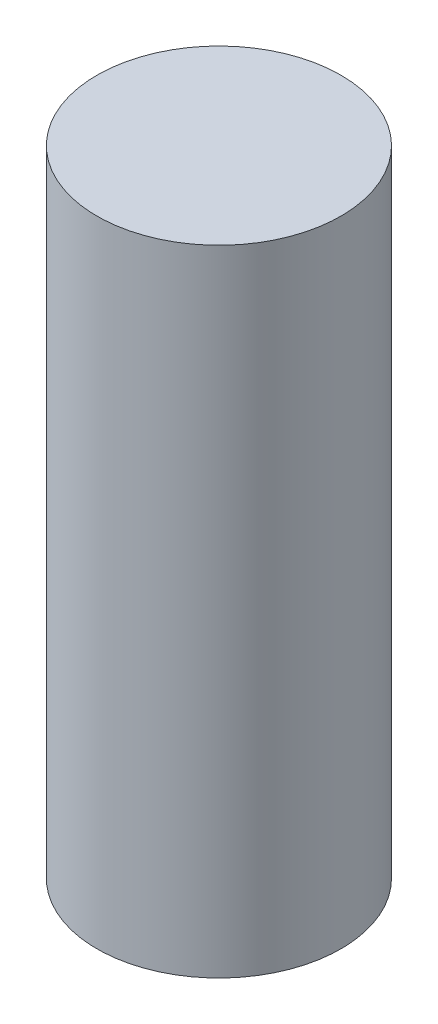
ISO-10303-21;
HEADER;
FILE_DESCRIPTION(('STEP AP214'),'2;1');
FILE_NAME('part.step','',(''),(''),'','','');
FILE_SCHEMA(('AUTOMOTIVE_DESIGN { 1 0 10303 214 1 1 1 1 }'));
ENDSEC;
DATA;
#1=APPLICATION_CONTEXT('core data for automotive mechanical design processes');
#2=APPLICATION_PROTOCOL_DEFINITION('international standard','automotive_design',2000,#1);
#3=PRODUCT_CONTEXT('',#1,'mechanical');
#4=PRODUCT('Part','Part','',(#3));
#5=PRODUCT_RELATED_PRODUCT_CATEGORY('part','',(#4));
#6=PRODUCT_DEFINITION_FORMATION('','',#4);
#7=PRODUCT_DEFINITION_CONTEXT('part definition',#1,'design');
#8=PRODUCT_DEFINITION('design','',#6,#7);
#9=PRODUCT_DEFINITION_SHAPE('','',#8);
#10=(LENGTH_UNIT() NAMED_UNIT(*) SI_UNIT(.MILLI.,.METRE.));
#11=(NAMED_UNIT(*) PLANE_ANGLE_UNIT() SI_UNIT($,.RADIAN.));
#12=(NAMED_UNIT(*) SI_UNIT($,.STERADIAN.) SOLID_ANGLE_UNIT());
#13=UNCERTAINTY_MEASURE_WITH_UNIT(LENGTH_MEASURE(1.E-05),#10,'distance_accuracy_value','');
#14=(GEOMETRIC_REPRESENTATION_CONTEXT(3) GLOBAL_UNCERTAINTY_ASSIGNED_CONTEXT((#13)) GLOBAL_UNIT_ASSIGNED_CONTEXT((#10,
#11,#12)) REPRESENTATION_CONTEXT('',''));
#15=CARTESIAN_POINT('',(0.,0.,0.));
#16=DIRECTION('',(0.,0.,1.));
#17=DIRECTION('',(1.,0.,0.));
#18=AXIS2_PLACEMENT_3D('',#15,#16,#17);
#19=CARTESIAN_POINT('',(0.,13.,0.));
#20=DIRECTION('',(0.,-1.,0.));
#21=DIRECTION('',(0.,0.,-1.));
#22=AXIS2_PLACEMENT_3D('',#19,#20,#21);
#23=CYLINDRICAL_SURFACE('',#22,2.5);
#24=CARTESIAN_POINT('',(0.,13.,0.));
#25=DIRECTION('',(0.,1.,0.));
#26=DIRECTION('',(0.,0.,1.));
#27=AXIS2_PLACEMENT_3D('',#24,#25,#26);
#28=CIRCLE('',#27,2.5);
#29=CARTESIAN_POINT('',(0.,13.,-2.5));
#30=VERTEX_POINT('',#29);
#31=EDGE_CURVE('E10',#30,#30,#28,.T.);
#32=CARTESIAN_POINT('',(0.,0.,0.));
#33=DIRECTION('',(0.,1.,0.));
#34=DIRECTION('',(0.,0.,1.));
#35=AXIS2_PLACEMENT_3D('',#32,#33,#34);
#36=CIRCLE('',#35,2.5);
#37=CARTESIAN_POINT('',(0.,0.,-2.5));
#38=VERTEX_POINT('',#37);
#39=EDGE_CURVE('E34',#38,#38,#36,.T.);
#40=CARTESIAN_POINT('',(0.,13.,-2.5));
#41=CARTESIAN_POINT('',(0.,12.8645833333333,-2.5));
#42=CARTESIAN_POINT('',(0.,12.7291666666667,-2.5));
#43=CARTESIAN_POINT('',(0.,12.4583333333333,-2.5));
#44=CARTESIAN_POINT('',(0.,12.3229166666667,-2.5));
#45=CARTESIAN_POINT('',(0.,12.0520833333333,-2.5));
#46=CARTESIAN_POINT('',(0.,11.9166666666667,-2.5));
#47=CARTESIAN_POINT('',(0.,11.6458333333333,-2.5));
#48=CARTESIAN_POINT('',(0.,11.5104166666667,-2.5));
#49=CARTESIAN_POINT('',(0.,11.2395833333333,-2.5));
#50=CARTESIAN_POINT('',(0.,11.1041666666667,-2.5));
#51=CARTESIAN_POINT('',(0.,10.8333333333333,-2.5));
#52=CARTESIAN_POINT('',(0.,10.6979166666667,-2.5));
#53=CARTESIAN_POINT('',(0.,10.4270833333333,-2.5));
#54=CARTESIAN_POINT('',(0.,10.2916666666667,-2.5));
#55=CARTESIAN_POINT('',(0.,10.0208333333333,-2.5));
#56=CARTESIAN_POINT('',(0.,9.88541666666667,-2.5));
#57=CARTESIAN_POINT('',(0.,9.61458333333333,-2.5));
#58=CARTESIAN_POINT('',(0.,9.47916666666667,-2.5));
#59=CARTESIAN_POINT('',(0.,9.20833333333333,-2.5));
#60=CARTESIAN_POINT('',(0.,9.07291666666667,-2.5));
#61=CARTESIAN_POINT('',(0.,8.80208333333333,-2.5));
#62=CARTESIAN_POINT('',(0.,8.66666666666667,-2.5));
#63=CARTESIAN_POINT('',(0.,8.39583333333333,-2.5));
#64=CARTESIAN_POINT('',(0.,8.26041666666667,-2.5));
#65=CARTESIAN_POINT('',(0.,7.98958333333333,-2.5));
#66=CARTESIAN_POINT('',(0.,7.85416666666667,-2.5));
#67=CARTESIAN_POINT('',(0.,7.58333333333333,-2.5));
#68=CARTESIAN_POINT('',(0.,7.44791666666667,-2.5));
#69=CARTESIAN_POINT('',(0.,7.17708333333333,-2.5));
#70=CARTESIAN_POINT('',(0.,7.04166666666667,-2.5));
#71=CARTESIAN_POINT('',(0.,6.77083333333333,-2.5));
#72=CARTESIAN_POINT('',(0.,6.63541666666667,-2.5));
#73=CARTESIAN_POINT('',(0.,6.36458333333333,-2.5));
#74=CARTESIAN_POINT('',(0.,6.22916666666667,-2.5));
#75=CARTESIAN_POINT('',(0.,5.95833333333333,-2.5));
#76=CARTESIAN_POINT('',(0.,5.82291666666667,-2.5));
#77=CARTESIAN_POINT('',(0.,5.55208333333333,-2.5));
#78=CARTESIAN_POINT('',(0.,5.41666666666667,-2.5));
#79=CARTESIAN_POINT('',(0.,5.14583333333333,-2.5));
#80=CARTESIAN_POINT('',(0.,5.01041666666667,-2.5));
#81=CARTESIAN_POINT('',(0.,4.73958333333333,-2.5));
#82=CARTESIAN_POINT('',(0.,4.60416666666667,-2.5));
#83=CARTESIAN_POINT('',(0.,4.33333333333333,-2.5));
#84=CARTESIAN_POINT('',(0.,4.19791666666667,-2.5));
#85=CARTESIAN_POINT('',(0.,3.92708333333333,-2.5));
#86=CARTESIAN_POINT('',(0.,3.79166666666667,-2.5));
#87=CARTESIAN_POINT('',(0.,3.52083333333333,-2.5));
#88=CARTESIAN_POINT('',(0.,3.38541666666667,-2.5));
#89=CARTESIAN_POINT('',(0.,3.11458333333333,-2.5));
#90=CARTESIAN_POINT('',(0.,2.97916666666667,-2.5));
#91=CARTESIAN_POINT('',(0.,2.70833333333333,-2.5));
#92=CARTESIAN_POINT('',(0.,2.57291666666667,-2.5));
#93=CARTESIAN_POINT('',(0.,2.30208333333333,-2.5));
#94=CARTESIAN_POINT('',(0.,2.16666666666667,-2.5));
#95=CARTESIAN_POINT('',(0.,1.89583333333333,-2.5));
#96=CARTESIAN_POINT('',(0.,1.76041666666667,-2.5));
#97=CARTESIAN_POINT('',(0.,1.48958333333333,-2.5));
#98=CARTESIAN_POINT('',(0.,1.35416666666667,-2.5));
#99=CARTESIAN_POINT('',(0.,1.08333333333333,-2.5));
#100=CARTESIAN_POINT('',(0.,0.947916666666667,-2.5));
#101=CARTESIAN_POINT('',(0.,0.677083333333334,-2.5));
#102=CARTESIAN_POINT('',(0.,0.541666666666667,-2.5));
#103=CARTESIAN_POINT('',(0.,0.270833333333334,-2.5));
#104=CARTESIAN_POINT('',(0.,0.135416666666667,-2.5));
#105=CARTESIAN_POINT('',(0.,0.,-2.5));
#106=B_SPLINE_CURVE_WITH_KNOTS('',3,(#40,#41,#42,#43,#44,#45,#46,#47,#48,#49,#50,#51,#52,#53,
#54,#55,#56,#57,#58,#59,#60,#61,#62,#63,#64,#65,#66,#67,#68,#69,#70,#71,#72,#73,#74,#75,#76,#77,
#78,#79,#80,#81,#82,#83,#84,#85,#86,#87,#88,#89,#90,#91,#92,#93,#94,#95,#96,#97,#98,#99,#100,
#101,#102,#103,#104,#105),.UNSPECIFIED.,.F.,.F.,(4,2,2,2,2,2,2,2,2,2,2,2,2,2,2,2,2,2,2,2,2,2,2,
2,2,2,2,2,2,2,2,2,4),(0.,0.406249999999999,0.812499999999999,1.21875,1.625,2.03125,2.4375,
2.84375,3.25,3.65625,4.0625,4.46875,4.875,5.28125,5.6875,6.09375,6.5,6.90625,7.3125,7.71875,
8.125,8.53125,8.9375,9.34375,9.75,10.15625,10.5625,10.96875,11.375,11.78125,12.1875,12.59375,
13.),.UNSPECIFIED.);
#107=EDGE_CURVE('BSEAM31',#30,#38,#106,.T.);
#108=ORIENTED_EDGE('',*,*,#31,.F.);
#109=ORIENTED_EDGE('',*,*,#39,.T.);
#110=ORIENTED_EDGE('',*,*,#107,.T.);
#111=ORIENTED_EDGE('',*,*,#107,.F.);
#112=EDGE_LOOP('',(#108,#110,#109,#111));
#113=FACE_BOUND('',#112,.T.);
#114=ADVANCED_FACE('F31',(#113),#23,.T.);
#115=CARTESIAN_POINT('',(0.,13.,0.));
#116=DIRECTION('',(0.,1.,0.));
#117=DIRECTION('',(0.,0.,1.));
#118=AXIS2_PLACEMENT_3D('',#115,#116,#117);
#119=PLANE('',#118);
#120=ORIENTED_EDGE('',*,*,#31,.T.);
#121=EDGE_LOOP('',(#120));
#122=FACE_BOUND('',#121,.T.);
#123=ADVANCED_FACE('F46',(#122),#119,.T.);
#124=CARTESIAN_POINT('',(0.,0.,0.));
#125=DIRECTION('',(0.,1.,0.));
#126=DIRECTION('',(0.,0.,1.));
#127=AXIS2_PLACEMENT_3D('',#124,#125,#126);
#128=PLANE('',#127);
#129=ORIENTED_EDGE('',*,*,#39,.F.);
#130=EDGE_LOOP('',(#129));
#131=FACE_BOUND('',#130,.T.);
#132=ADVANCED_FACE('F44',(#131),#128,.F.);
#133=CLOSED_SHELL('',(#114,#123,#132));
#134=MANIFOLD_SOLID_BREP('B2',#133);
#135=ADVANCED_BREP_SHAPE_REPRESENTATION('',(#18,#134),#14);
#136=SHAPE_DEFINITION_REPRESENTATION(#9,#135);
ENDSEC;
END-ISO-10303-21;
